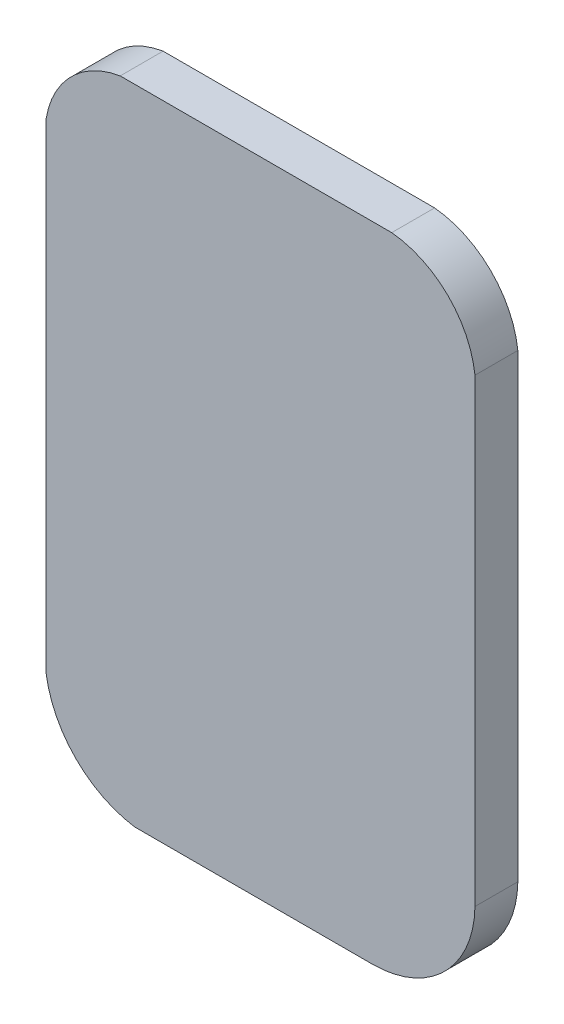
ISO-10303-21;
HEADER;
FILE_DESCRIPTION(('STEP AP214'),'2;1');
FILE_NAME('part.step','',(''),(''),'','','');
FILE_SCHEMA(('AUTOMOTIVE_DESIGN { 1 0 10303 214 1 1 1 1 }'));
ENDSEC;
DATA;
#1=APPLICATION_CONTEXT('core data for automotive mechanical design processes');
#2=APPLICATION_PROTOCOL_DEFINITION('international standard','automotive_design',2000,#1);
#3=PRODUCT_CONTEXT('',#1,'mechanical');
#4=PRODUCT('Part','Part','',(#3));
#5=PRODUCT_RELATED_PRODUCT_CATEGORY('part','',(#4));
#6=PRODUCT_DEFINITION_FORMATION('','',#4);
#7=PRODUCT_DEFINITION_CONTEXT('part definition',#1,'design');
#8=PRODUCT_DEFINITION('design','',#6,#7);
#9=PRODUCT_DEFINITION_SHAPE('','',#8);
#10=(LENGTH_UNIT() NAMED_UNIT(*) SI_UNIT(.MILLI.,.METRE.));
#11=(NAMED_UNIT(*) PLANE_ANGLE_UNIT() SI_UNIT($,.RADIAN.));
#12=(NAMED_UNIT(*) SI_UNIT($,.STERADIAN.) SOLID_ANGLE_UNIT());
#13=UNCERTAINTY_MEASURE_WITH_UNIT(LENGTH_MEASURE(1.E-05),#10,'distance_accuracy_value','');
#14=(GEOMETRIC_REPRESENTATION_CONTEXT(3) GLOBAL_UNCERTAINTY_ASSIGNED_CONTEXT((#13)) GLOBAL_UNIT_ASSIGNED_CONTEXT((#10,
#11,#12)) REPRESENTATION_CONTEXT('',''));
#15=CARTESIAN_POINT('',(0.,0.,0.));
#16=DIRECTION('',(0.,0.,1.));
#17=DIRECTION('',(1.,0.,0.));
#18=AXIS2_PLACEMENT_3D('',#15,#16,#17);
#19=CARTESIAN_POINT('',(312.329047898273,-612.329047898273,120.));
#20=DIRECTION('',(0.,0.,-1.));
#21=DIRECTION('',(-1.,0.,0.));
#22=AXIS2_PLACEMENT_3D('',#19,#20,#21);
#23=CYLINDRICAL_SURFACE('',#22,287.70378865659);
#24=CARTESIAN_POINT('',(312.329047898273,-612.329047898273,0.));
#25=DIRECTION('',(0.,0.,1.));
#26=DIRECTION('',(1.,0.,0.));
#27=AXIS2_PLACEMENT_3D('',#24,#25,#26);
#28=CIRCLE('',#27,287.70378865659);
#29=CARTESIAN_POINT('',(600.,-616.67569306919,0.));
#30=VERTEX_POINT('',#29);
#31=CARTESIAN_POINT('',(316.675693069189,-900.,0.));
#32=VERTEX_POINT('',#31);
#33=EDGE_CURVE('E139',#30,#32,#28,.F.);
#34=ORIENTED_EDGE('',*,*,#33,.F.);
#35=DIRECTION('',(0.,0.,-1.));
#36=VECTOR('',#35,1.);
#37=CARTESIAN_POINT('',(600.,-616.67569306919,120.));
#38=LINE('',#37,#36);
#39=CARTESIAN_POINT('',(600.,-616.67569306919,120.));
#40=VERTEX_POINT('',#39);
#41=EDGE_CURVE('E11',#40,#30,#38,.T.);
#42=ORIENTED_EDGE('',*,*,#41,.F.);
#43=CARTESIAN_POINT('',(312.329047898273,-612.329047898273,120.));
#44=DIRECTION('',(0.,0.,1.));
#45=DIRECTION('',(1.,0.,0.));
#46=AXIS2_PLACEMENT_3D('',#43,#44,#45);
#47=CIRCLE('',#46,287.70378865659);
#48=CARTESIAN_POINT('',(316.675693069189,-900.,120.));
#49=VERTEX_POINT('',#48);
#50=EDGE_CURVE('E167',#40,#49,#47,.F.);
#51=ORIENTED_EDGE('',*,*,#50,.T.);
#52=DIRECTION('',(0.,0.,-1.));
#53=VECTOR('',#52,1.);
#54=CARTESIAN_POINT('',(316.675693069189,-900.,120.));
#55=LINE('',#54,#53);
#56=EDGE_CURVE('E92',#49,#32,#55,.T.);
#57=ORIENTED_EDGE('',*,*,#56,.T.);
#58=EDGE_LOOP('',(#34,#42,#51,#57));
#59=FACE_BOUND('',#58,.T.);
#60=ADVANCED_FACE('F41',(#59),#23,.T.);
#61=CARTESIAN_POINT('',(600.,1.03461187328414E-13,120.));
#62=DIRECTION('',(1.,0.,0.));
#63=DIRECTION('',(0.,1.,0.));
#64=AXIS2_PLACEMENT_3D('',#61,#62,#63);
#65=PLANE('',#64);
#66=DIRECTION('',(0.,-1.,0.));
#67=VECTOR('',#66,1.);
#68=CARTESIAN_POINT('',(600.,1.03461187328414E-13,0.));
#69=LINE('',#68,#67);
#70=CARTESIAN_POINT('',(600.,671.022296826481,0.));
#71=VERTEX_POINT('',#70);
#72=EDGE_CURVE('E143',#71,#30,#69,.T.);
#73=ORIENTED_EDGE('',*,*,#72,.F.);
#74=DIRECTION('',(0.,0.,-1.));
#75=VECTOR('',#74,1.);
#76=CARTESIAN_POINT('',(600.,671.022296826481,120.));
#77=LINE('',#76,#75);
#78=CARTESIAN_POINT('',(600.,671.022296826481,120.));
#79=VERTEX_POINT('',#78);
#80=EDGE_CURVE('E50',#79,#71,#77,.T.);
#81=ORIENTED_EDGE('',*,*,#80,.F.);
#82=DIRECTION('',(0.,-1.,0.));
#83=VECTOR('',#82,1.);
#84=CARTESIAN_POINT('',(600.,1.03461187328414E-13,120.));
#85=LINE('',#84,#83);
#86=EDGE_CURVE('E194',#79,#40,#85,.T.);
#87=ORIENTED_EDGE('',*,*,#86,.T.);
#88=ORIENTED_EDGE('',*,*,#41,.T.);
#89=EDGE_LOOP('',(#73,#81,#87,#88));
#90=FACE_BOUND('',#89,.T.);
#91=ADVANCED_FACE('F193',(#90),#65,.T.);
#92=CARTESIAN_POINT('',(341.861680125557,641.390001836839,120.));
#93=DIRECTION('',(0.,0.,-1.));
#94=DIRECTION('',(-1.,0.,0.));
#95=AXIS2_PLACEMENT_3D('',#92,#93,#94);
#96=CYLINDRICAL_SURFACE('',#95,259.833533428527);
#97=CARTESIAN_POINT('',(341.861680125557,641.390001836839,0.));
#98=DIRECTION('',(0.,0.,1.));
#99=DIRECTION('',(1.,0.,0.));
#100=AXIS2_PLACEMENT_3D('',#97,#98,#99);
#101=CIRCLE('',#100,259.833533428527);
#102=CARTESIAN_POINT('',(367.047667181925,900.,0.));
#103=VERTEX_POINT('',#102);
#104=EDGE_CURVE('E147',#71,#103,#101,.T.);
#105=ORIENTED_EDGE('',*,*,#104,.T.);
#106=DIRECTION('',(0.,0.,-1.));
#107=VECTOR('',#106,1.);
#108=CARTESIAN_POINT('',(367.047667181925,900.,120.));
#109=LINE('',#108,#107);
#110=CARTESIAN_POINT('',(367.047667181925,900.,120.));
#111=VERTEX_POINT('',#110);
#112=EDGE_CURVE('E177',#111,#103,#109,.T.);
#113=ORIENTED_EDGE('',*,*,#112,.F.);
#114=CARTESIAN_POINT('',(341.861680125557,641.390001836839,120.));
#115=DIRECTION('',(0.,0.,1.));
#116=DIRECTION('',(1.,0.,0.));
#117=AXIS2_PLACEMENT_3D('',#114,#115,#116);
#118=CIRCLE('',#117,259.833533428527);
#119=EDGE_CURVE('E185',#79,#111,#118,.T.);
#120=ORIENTED_EDGE('',*,*,#119,.F.);
#121=ORIENTED_EDGE('',*,*,#80,.T.);
#122=EDGE_LOOP('',(#105,#113,#120,#121));
#123=FACE_BOUND('',#122,.T.);
#124=ADVANCED_FACE('F183',(#123),#96,.T.);
#125=CARTESIAN_POINT('',(1.31505894866158E-13,900.,120.));
#126=DIRECTION('',(0.,1.,0.));
#127=DIRECTION('',(-1.,0.,0.));
#128=AXIS2_PLACEMENT_3D('',#125,#126,#127);
#129=PLANE('',#128);
#130=DIRECTION('',(1.,0.,0.));
#131=VECTOR('',#130,1.);
#132=CARTESIAN_POINT('',(1.31505894866158E-13,900.,0.));
#133=LINE('',#132,#131);
#134=CARTESIAN_POINT('',(-392.766729868181,900.,0.));
#135=VERTEX_POINT('',#134);
#136=EDGE_CURVE('E151',#135,#103,#133,.T.);
#137=ORIENTED_EDGE('',*,*,#136,.F.);
#138=DIRECTION('',(0.,0.,-1.));
#139=VECTOR('',#138,1.);
#140=CARTESIAN_POINT('',(-392.766729868181,900.,120.));
#141=LINE('',#140,#139);
#142=CARTESIAN_POINT('',(-392.766729868181,900.,120.));
#143=VERTEX_POINT('',#142);
#144=EDGE_CURVE('E174',#143,#135,#141,.T.);
#145=ORIENTED_EDGE('',*,*,#144,.F.);
#146=DIRECTION('',(1.,0.,0.));
#147=VECTOR('',#146,1.);
#148=CARTESIAN_POINT('',(1.31505894866158E-13,900.,120.));
#149=LINE('',#148,#147);
#150=EDGE_CURVE('E203',#143,#111,#149,.T.);
#151=ORIENTED_EDGE('',*,*,#150,.T.);
#152=ORIENTED_EDGE('',*,*,#112,.T.);
#153=EDGE_LOOP('',(#137,#145,#151,#152));
#154=FACE_BOUND('',#153,.T.);
#155=ADVANCED_FACE('F211',(#154),#129,.T.);
#156=CARTESIAN_POINT('',(-352.262218357689,652.262218357689,120.));
#157=DIRECTION('',(0.,0.,-1.));
#158=DIRECTION('',(-1.,0.,0.));
#159=AXIS2_PLACEMENT_3D('',#156,#157,#158);
#160=CYLINDRICAL_SURFACE('',#159,251.027137787446);
#161=CARTESIAN_POINT('',(-352.262218357689,652.262218357689,0.));
#162=DIRECTION('',(0.,0.,1.));
#163=DIRECTION('',(1.,0.,0.));
#164=AXIS2_PLACEMENT_3D('',#161,#162,#163);
#165=CIRCLE('',#164,251.027137787446);
#166=CARTESIAN_POINT('',(-600.,692.76672986818,0.));
#167=VERTEX_POINT('',#166);
#168=EDGE_CURVE('E155',#167,#135,#165,.F.);
#169=ORIENTED_EDGE('',*,*,#168,.F.);
#170=DIRECTION('',(0.,0.,-1.));
#171=VECTOR('',#170,1.);
#172=CARTESIAN_POINT('',(-600.,692.76672986818,120.));
#173=LINE('',#172,#171);
#174=CARTESIAN_POINT('',(-600.,692.76672986818,120.));
#175=VERTEX_POINT('',#174);
#176=EDGE_CURVE('E130',#175,#167,#173,.T.);
#177=ORIENTED_EDGE('',*,*,#176,.F.);
#178=CARTESIAN_POINT('',(-352.262218357689,652.262218357689,120.));
#179=DIRECTION('',(0.,0.,1.));
#180=DIRECTION('',(1.,0.,0.));
#181=AXIS2_PLACEMENT_3D('',#178,#179,#180);
#182=CIRCLE('',#181,251.027137787446);
#183=EDGE_CURVE('E117',#175,#143,#182,.F.);
#184=ORIENTED_EDGE('',*,*,#183,.T.);
#185=ORIENTED_EDGE('',*,*,#144,.T.);
#186=EDGE_LOOP('',(#169,#177,#184,#185));
#187=FACE_BOUND('',#186,.T.);
#188=ADVANCED_FACE('F209',(#187),#160,.T.);
#189=CARTESIAN_POINT('',(-600.,0.,120.));
#190=DIRECTION('',(1.,0.,0.));
#191=DIRECTION('',(0.,1.,0.));
#192=AXIS2_PLACEMENT_3D('',#189,#190,#191);
#193=PLANE('',#192);
#194=DIRECTION('',(0.,-1.,0.));
#195=VECTOR('',#194,1.);
#196=CARTESIAN_POINT('',(-600.,0.,0.));
#197=LINE('',#196,#195);
#198=CARTESIAN_POINT('',(-600.,-652.262218357689,0.));
#199=VERTEX_POINT('',#198);
#200=EDGE_CURVE('E125',#167,#199,#197,.T.);
#201=ORIENTED_EDGE('',*,*,#200,.T.);
#202=DIRECTION('',(0.,0.,-1.));
#203=VECTOR('',#202,1.);
#204=CARTESIAN_POINT('',(-600.,-652.262218357689,120.));
#205=LINE('',#204,#203);
#206=CARTESIAN_POINT('',(-600.,-652.262218357689,120.));
#207=VERTEX_POINT('',#206);
#208=EDGE_CURVE('E122',#207,#199,#205,.T.);
#209=ORIENTED_EDGE('',*,*,#208,.F.);
#210=DIRECTION('',(0.,-1.,0.));
#211=VECTOR('',#210,1.);
#212=CARTESIAN_POINT('',(-600.,0.,120.));
#213=LINE('',#212,#211);
#214=EDGE_CURVE('E110',#175,#207,#213,.T.);
#215=ORIENTED_EDGE('',*,*,#214,.F.);
#216=ORIENTED_EDGE('',*,*,#176,.T.);
#217=EDGE_LOOP('',(#201,#209,#215,#216));
#218=FACE_BOUND('',#217,.T.);
#219=ADVANCED_FACE('F123',(#218),#193,.F.);
#220=CARTESIAN_POINT('',(-307.982402727358,-607.982402727358,120.));
#221=DIRECTION('',(0.,0.,-1.));
#222=DIRECTION('',(-1.,0.,0.));
#223=AXIS2_PLACEMENT_3D('',#220,#221,#222);
#224=CYLINDRICAL_SURFACE('',#223,295.355682506944);
#225=CARTESIAN_POINT('',(-307.982402727358,-607.982402727358,0.));
#226=DIRECTION('',(0.,0.,1.));
#227=DIRECTION('',(1.,0.,0.));
#228=AXIS2_PLACEMENT_3D('',#225,#226,#227);
#229=CIRCLE('',#228,295.355682506944);
#230=CARTESIAN_POINT('',(-352.262218357689,-900.,0.));
#231=VERTEX_POINT('',#230);
#232=EDGE_CURVE('E161',#231,#199,#229,.F.);
#233=ORIENTED_EDGE('',*,*,#232,.F.);
#234=DIRECTION('',(0.,0.,-1.));
#235=VECTOR('',#234,1.);
#236=CARTESIAN_POINT('',(-352.262218357689,-900.,120.));
#237=LINE('',#236,#235);
#238=CARTESIAN_POINT('',(-352.262218357689,-900.,120.));
#239=VERTEX_POINT('',#238);
#240=EDGE_CURVE('E85',#239,#231,#237,.T.);
#241=ORIENTED_EDGE('',*,*,#240,.F.);
#242=CARTESIAN_POINT('',(-307.982402727358,-607.982402727358,120.));
#243=DIRECTION('',(0.,0.,1.));
#244=DIRECTION('',(1.,0.,0.));
#245=AXIS2_PLACEMENT_3D('',#242,#243,#244);
#246=CIRCLE('',#245,295.355682506944);
#247=EDGE_CURVE('E114',#239,#207,#246,.F.);
#248=ORIENTED_EDGE('',*,*,#247,.T.);
#249=ORIENTED_EDGE('',*,*,#208,.T.);
#250=EDGE_LOOP('',(#233,#241,#248,#249));
#251=FACE_BOUND('',#250,.T.);
#252=ADVANCED_FACE('F132',(#251),#224,.T.);
#253=CARTESIAN_POINT('',(1.49371220421832E-13,-900.,120.));
#254=DIRECTION('',(0.,1.,0.));
#255=DIRECTION('',(-1.,0.,0.));
#256=AXIS2_PLACEMENT_3D('',#253,#254,#255);
#257=PLANE('',#256);
#258=DIRECTION('',(1.,0.,0.));
#259=VECTOR('',#258,1.);
#260=CARTESIAN_POINT('',(1.49371220421832E-13,-900.,0.));
#261=LINE('',#260,#259);
#262=EDGE_CURVE('E164',#231,#32,#261,.T.);
#263=ORIENTED_EDGE('',*,*,#262,.T.);
#264=ORIENTED_EDGE('',*,*,#56,.F.);
#265=DIRECTION('',(1.,0.,0.));
#266=VECTOR('',#265,1.);
#267=CARTESIAN_POINT('',(1.49371220421832E-13,-900.,120.));
#268=LINE('',#267,#266);
#269=EDGE_CURVE('E58',#239,#49,#268,.T.);
#270=ORIENTED_EDGE('',*,*,#269,.F.);
#271=ORIENTED_EDGE('',*,*,#240,.T.);
#272=EDGE_LOOP('',(#263,#264,#270,#271));
#273=FACE_BOUND('',#272,.T.);
#274=ADVANCED_FACE('F195',(#273),#257,.F.);
#275=CARTESIAN_POINT('',(0.,0.,120.));
#276=DIRECTION('',(0.,0.,1.));
#277=DIRECTION('',(1.,0.,0.));
#278=AXIS2_PLACEMENT_3D('',#275,#276,#277);
#279=PLANE('',#278);
#280=ORIENTED_EDGE('',*,*,#50,.F.);
#281=ORIENTED_EDGE('',*,*,#86,.F.);
#282=ORIENTED_EDGE('',*,*,#119,.T.);
#283=ORIENTED_EDGE('',*,*,#150,.F.);
#284=ORIENTED_EDGE('',*,*,#183,.F.);
#285=ORIENTED_EDGE('',*,*,#214,.T.);
#286=ORIENTED_EDGE('',*,*,#247,.F.);
#287=ORIENTED_EDGE('',*,*,#269,.T.);
#288=EDGE_LOOP('',(#280,#281,#282,#283,#284,#285,#286,#287));
#289=FACE_BOUND('',#288,.T.);
#290=ADVANCED_FACE('F112',(#289),#279,.T.);
#291=CARTESIAN_POINT('',(0.,0.,0.));
#292=DIRECTION('',(0.,0.,1.));
#293=DIRECTION('',(1.,0.,0.));
#294=AXIS2_PLACEMENT_3D('',#291,#292,#293);
#295=PLANE('',#294);
#296=ORIENTED_EDGE('',*,*,#33,.T.);
#297=ORIENTED_EDGE('',*,*,#262,.F.);
#298=ORIENTED_EDGE('',*,*,#232,.T.);
#299=ORIENTED_EDGE('',*,*,#200,.F.);
#300=ORIENTED_EDGE('',*,*,#168,.T.);
#301=ORIENTED_EDGE('',*,*,#136,.T.);
#302=ORIENTED_EDGE('',*,*,#104,.F.);
#303=ORIENTED_EDGE('',*,*,#72,.T.);
#304=EDGE_LOOP('',(#296,#297,#298,#299,#300,#301,#302,#303));
#305=FACE_BOUND('',#304,.T.);
#306=ADVANCED_FACE('F191',(#305),#295,.F.);
#307=CLOSED_SHELL('',(#60,#91,#124,#155,#188,#219,#252,#274,#290,#306));
#308=MANIFOLD_SOLID_BREP('B2',#307);
#309=ADVANCED_BREP_SHAPE_REPRESENTATION('',(#18,#308),#14);
#310=SHAPE_DEFINITION_REPRESENTATION(#9,#309);
ENDSEC;
END-ISO-10303-21;
